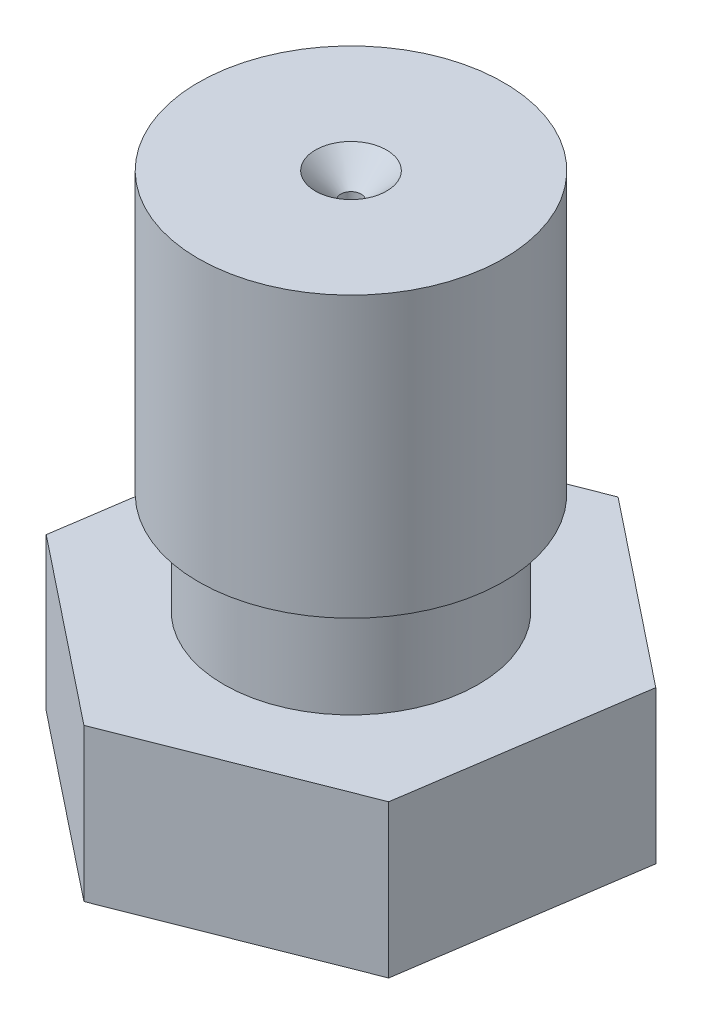
ISO-10303-21;
HEADER;
FILE_DESCRIPTION(('STEP AP214'),'2;1');
FILE_NAME('part.step','',(''),(''),'','','');
FILE_SCHEMA(('AUTOMOTIVE_DESIGN { 1 0 10303 214 1 1 1 1 }'));
ENDSEC;
DATA;
#1=APPLICATION_CONTEXT('core data for automotive mechanical design processes');
#2=APPLICATION_PROTOCOL_DEFINITION('international standard','automotive_design',2000,#1);
#3=PRODUCT_CONTEXT('',#1,'mechanical');
#4=PRODUCT('Part','Part','',(#3));
#5=PRODUCT_RELATED_PRODUCT_CATEGORY('part','',(#4));
#6=PRODUCT_DEFINITION_FORMATION('','',#4);
#7=PRODUCT_DEFINITION_CONTEXT('part definition',#1,'design');
#8=PRODUCT_DEFINITION('design','',#6,#7);
#9=PRODUCT_DEFINITION_SHAPE('','',#8);
#10=(LENGTH_UNIT() NAMED_UNIT(*) SI_UNIT(.MILLI.,.METRE.));
#11=(NAMED_UNIT(*) PLANE_ANGLE_UNIT() SI_UNIT($,.RADIAN.));
#12=(NAMED_UNIT(*) SI_UNIT($,.STERADIAN.) SOLID_ANGLE_UNIT());
#13=UNCERTAINTY_MEASURE_WITH_UNIT(LENGTH_MEASURE(1.E-05),#10,'distance_accuracy_value','');
#14=(GEOMETRIC_REPRESENTATION_CONTEXT(3) GLOBAL_UNCERTAINTY_ASSIGNED_CONTEXT((#13)) GLOBAL_UNIT_ASSIGNED_CONTEXT((#10,
#11,#12)) REPRESENTATION_CONTEXT('',''));
#15=CARTESIAN_POINT('',(0.,0.,0.));
#16=DIRECTION('',(0.,0.,1.));
#17=DIRECTION('',(1.,0.,0.));
#18=AXIS2_PLACEMENT_3D('',#15,#16,#17);
#19=CARTESIAN_POINT('',(0.,2.,0.));
#20=DIRECTION('',(0.,1.,0.));
#21=DIRECTION('',(0.,0.,1.));
#22=AXIS2_PLACEMENT_3D('',#19,#20,#21);
#23=PLANE('',#22);
#24=CARTESIAN_POINT('',(0.,2.,0.));
#25=DIRECTION('',(0.,1.,0.));
#26=DIRECTION('',(0.,0.,1.));
#27=AXIS2_PLACEMENT_3D('',#24,#25,#26);
#28=CIRCLE('',#27,2.00041507641941);
#29=CARTESIAN_POINT('',(0.,2.,2.00041507641941));
#30=VERTEX_POINT('',#29);
#31=EDGE_CURVE('E130',#30,#30,#28,.T.);
#32=ORIENTED_EDGE('',*,*,#31,.T.);
#33=EDGE_LOOP('',(#32));
#34=FACE_BOUND('',#33,.T.);
#35=DIRECTION('',(0.782739224767982,0.,0.622349826070209));
#36=VECTOR('',#35,1.);
#37=CARTESIAN_POINT('',(-2.48939930428083,2.,3.13095689907193));
#38=LINE('',#37,#36);
#39=CARTESIAN_POINT('',(-4.29705811278113,2.,1.69370154062492));
#40=VERTEX_POINT('',#39);
#41=CARTESIAN_POINT('',(-0.681740495780542,2.,4.56821225751893));
#42=VERTEX_POINT('',#41);
#43=EDGE_CURVE('E116',#40,#42,#38,.T.);
#44=ORIENTED_EDGE('',*,*,#43,.F.);
#45=DIRECTION('',(-0.147601147033637,0.,0.989046966222714));
#46=VECTOR('',#45,1.);
#47=CARTESIAN_POINT('',(-3.95618786489085,2.,-0.590404588134547));
#48=LINE('',#47,#46);
#49=CARTESIAN_POINT('',(-3.61531761700058,2.,-2.87451071689401));
#50=VERTEX_POINT('',#49);
#51=EDGE_CURVE('E114',#50,#40,#48,.T.);
#52=ORIENTED_EDGE('',*,*,#51,.F.);
#53=DIRECTION('',(-0.930340371801619,0.,0.366697140152505));
#54=VECTOR('',#53,1.);
#55=CARTESIAN_POINT('',(-1.46678856061002,2.,-3.72136148720648));
#56=LINE('',#55,#54);
#57=CARTESIAN_POINT('',(0.681740495780541,2.,-4.56821225751893));
#58=VERTEX_POINT('',#57);
#59=EDGE_CURVE('E112',#58,#50,#56,.T.);
#60=ORIENTED_EDGE('',*,*,#59,.F.);
#61=DIRECTION('',(-0.782739224767982,0.,-0.622349826070209));
#62=VECTOR('',#61,1.);
#63=CARTESIAN_POINT('',(2.48939930428083,2.,-3.13095689907193));
#64=LINE('',#63,#62);
#65=CARTESIAN_POINT('',(4.29705811278112,2.,-1.69370154062492));
#66=VERTEX_POINT('',#65);
#67=EDGE_CURVE('E110',#66,#58,#64,.T.);
#68=ORIENTED_EDGE('',*,*,#67,.F.);
#69=DIRECTION('',(0.147601147033637,0.,-0.989046966222714));
#70=VECTOR('',#69,1.);
#71=CARTESIAN_POINT('',(3.95618786489085,2.,0.590404588134546));
#72=LINE('',#71,#70);
#73=CARTESIAN_POINT('',(3.61531761700058,2.,2.87451071689401));
#74=VERTEX_POINT('',#73);
#75=EDGE_CURVE('E72',#74,#66,#72,.T.);
#76=ORIENTED_EDGE('',*,*,#75,.F.);
#77=DIRECTION('',(0.930340371801619,0.,-0.366697140152505));
#78=VECTOR('',#77,1.);
#79=CARTESIAN_POINT('',(1.46678856061002,2.,3.72136148720648));
#80=LINE('',#79,#78);
#81=EDGE_CURVE('E102',#42,#74,#80,.T.);
#82=ORIENTED_EDGE('',*,*,#81,.F.);
#83=EDGE_LOOP('',(#44,#52,#60,#68,#76,#82));
#84=FACE_BOUND('',#83,.T.);
#85=ADVANCED_FACE('F16',(#34,#84),#23,.F.);
#86=CARTESIAN_POINT('',(0.,5.,0.));
#87=DIRECTION('',(0.,-1.,0.));
#88=DIRECTION('',(0.,0.,-1.));
#89=AXIS2_PLACEMENT_3D('',#86,#87,#88);
#90=PLANE('',#89);
#91=CARTESIAN_POINT('',(0.,5.,0.));
#92=DIRECTION('',(0.,1.,0.));
#93=DIRECTION('',(0.,0.,1.));
#94=AXIS2_PLACEMENT_3D('',#91,#92,#93);
#95=CIRCLE('',#94,2.5);
#96=CARTESIAN_POINT('',(0.,5.,2.5));
#97=VERTEX_POINT('',#96);
#98=EDGE_CURVE('E127',#97,#97,#95,.T.);
#99=ORIENTED_EDGE('',*,*,#98,.F.);
#100=EDGE_LOOP('',(#99));
#101=FACE_BOUND('',#100,.T.);
#102=DIRECTION('',(0.782739224767982,0.,0.622349826070209));
#103=VECTOR('',#102,1.);
#104=CARTESIAN_POINT('',(-4.29705811278113,5.,1.69370154062492));
#105=LINE('',#104,#103);
#106=CARTESIAN_POINT('',(-4.29705811278113,5.,1.69370154062492));
#107=VERTEX_POINT('',#106);
#108=CARTESIAN_POINT('',(-0.681740495780542,5.,4.56821225751893));
#109=VERTEX_POINT('',#108);
#110=EDGE_CURVE('E92',#107,#109,#105,.T.);
#111=ORIENTED_EDGE('',*,*,#110,.T.);
#112=DIRECTION('',(0.930340371801619,0.,-0.366697140152505));
#113=VECTOR('',#112,1.);
#114=CARTESIAN_POINT('',(-0.681740495780542,5.,4.56821225751893));
#115=LINE('',#114,#113);
#116=CARTESIAN_POINT('',(3.61531761700058,5.,2.87451071689401));
#117=VERTEX_POINT('',#116);
#118=EDGE_CURVE('E90',#109,#117,#115,.T.);
#119=ORIENTED_EDGE('',*,*,#118,.T.);
#120=DIRECTION('',(0.147601147033637,0.,-0.989046966222714));
#121=VECTOR('',#120,1.);
#122=CARTESIAN_POINT('',(3.61531761700058,5.,2.87451071689401));
#123=LINE('',#122,#121);
#124=CARTESIAN_POINT('',(4.29705811278112,5.,-1.69370154062492));
#125=VERTEX_POINT('',#124);
#126=EDGE_CURVE('E39',#117,#125,#123,.T.);
#127=ORIENTED_EDGE('',*,*,#126,.T.);
#128=DIRECTION('',(-0.782739224767982,0.,-0.622349826070208));
#129=VECTOR('',#128,1.);
#130=CARTESIAN_POINT('',(4.29705811278112,5.,-1.69370154062492));
#131=LINE('',#130,#129);
#132=CARTESIAN_POINT('',(0.681740495780541,5.,-4.56821225751893));
#133=VERTEX_POINT('',#132);
#134=EDGE_CURVE('E79',#125,#133,#131,.T.);
#135=ORIENTED_EDGE('',*,*,#134,.T.);
#136=DIRECTION('',(-0.930340371801619,0.,0.366697140152505));
#137=VECTOR('',#136,1.);
#138=CARTESIAN_POINT('',(0.681740495780541,5.,-4.56821225751893));
#139=LINE('',#138,#137);
#140=CARTESIAN_POINT('',(-3.61531761700058,5.,-2.87451071689401));
#141=VERTEX_POINT('',#140);
#142=EDGE_CURVE('E85',#133,#141,#139,.T.);
#143=ORIENTED_EDGE('',*,*,#142,.T.);
#144=DIRECTION('',(-0.147601147033637,0.,0.989046966222714));
#145=VECTOR('',#144,1.);
#146=CARTESIAN_POINT('',(-3.61531761700058,5.,-2.87451071689401));
#147=LINE('',#146,#145);
#148=EDGE_CURVE('E97',#141,#107,#147,.T.);
#149=ORIENTED_EDGE('',*,*,#148,.T.);
#150=EDGE_LOOP('',(#111,#119,#127,#135,#143,#149));
#151=FACE_BOUND('',#150,.T.);
#152=ADVANCED_FACE('F89',(#101,#151),#90,.F.);
#153=CARTESIAN_POINT('',(0.,12.5,0.));
#154=DIRECTION('',(0.,1.,0.));
#155=DIRECTION('',(0.,0.,1.));
#156=AXIS2_PLACEMENT_3D('',#153,#154,#155);
#157=PLANE('',#156);
#158=CARTESIAN_POINT('',(0.,12.5,0.));
#159=DIRECTION('',(0.,1.,0.));
#160=DIRECTION('',(0.,0.,1.));
#161=AXIS2_PLACEMENT_3D('',#158,#159,#160);
#162=CIRCLE('',#161,0.7);
#163=CARTESIAN_POINT('',(0.,12.5,0.700000000000002));
#164=VERTEX_POINT('',#163);
#165=EDGE_CURVE('E11',#164,#164,#162,.F.);
#166=ORIENTED_EDGE('',*,*,#165,.T.);
#167=EDGE_LOOP('',(#166));
#168=FACE_BOUND('',#167,.T.);
#169=CARTESIAN_POINT('',(0.,12.5,0.));
#170=DIRECTION('',(0.,1.,0.));
#171=DIRECTION('',(0.,0.,1.));
#172=AXIS2_PLACEMENT_3D('',#169,#170,#171);
#173=CIRCLE('',#172,3.);
#174=CARTESIAN_POINT('',(0.,12.5,3.));
#175=VERTEX_POINT('',#174);
#176=EDGE_CURVE('E118',#175,#175,#173,.T.);
#177=ORIENTED_EDGE('',*,*,#176,.T.);
#178=EDGE_LOOP('',(#177));
#179=FACE_BOUND('',#178,.T.);
#180=ADVANCED_FACE('F168',(#168,#179),#157,.T.);
#181=CARTESIAN_POINT('',(0.,12.5,0.));
#182=DIRECTION('',(0.,1.,0.));
#183=DIRECTION('',(0.,0.,1.));
#184=AXIS2_PLACEMENT_3D('',#181,#182,#183);
#185=CYLINDRICAL_SURFACE('',#184,0.2);
#186=CARTESIAN_POINT('',(0.,12.,0.));
#187=DIRECTION('',(0.,1.,0.));
#188=DIRECTION('',(0.,0.,1.));
#189=AXIS2_PLACEMENT_3D('',#186,#187,#188);
#190=CIRCLE('',#189,0.2);
#191=CARTESIAN_POINT('',(0.,12.,0.199999999999999));
#192=VERTEX_POINT('',#191);
#193=EDGE_CURVE('E24',#192,#192,#190,.T.);
#194=ORIENTED_EDGE('',*,*,#193,.T.);
#195=EDGE_LOOP('',(#194));
#196=FACE_BOUND('',#195,.T.);
#197=CARTESIAN_POINT('',(0.,0.,0.));
#198=DIRECTION('',(0.,1.,0.));
#199=DIRECTION('',(0.,0.,1.));
#200=AXIS2_PLACEMENT_3D('',#197,#198,#199);
#201=CIRCLE('',#200,0.2);
#202=CARTESIAN_POINT('',(0.,0.,0.2));
#203=VERTEX_POINT('',#202);
#204=EDGE_CURVE('E136',#203,#203,#201,.T.);
#205=ORIENTED_EDGE('',*,*,#204,.F.);
#206=EDGE_LOOP('',(#205));
#207=FACE_BOUND('',#206,.T.);
#208=ADVANCED_FACE('F141',(#196,#207),#185,.F.);
#209=CARTESIAN_POINT('',(0.,0.,0.));
#210=DIRECTION('',(0.,1.,0.));
#211=DIRECTION('',(0.,0.,1.));
#212=AXIS2_PLACEMENT_3D('',#209,#210,#211);
#213=PLANE('',#212);
#214=CARTESIAN_POINT('',(0.,0.,0.));
#215=DIRECTION('',(0.,1.,0.));
#216=DIRECTION('',(0.,0.,1.));
#217=AXIS2_PLACEMENT_3D('',#214,#215,#216);
#218=CIRCLE('',#217,0.6);
#219=CARTESIAN_POINT('',(0.,0.,0.6));
#220=VERTEX_POINT('',#219);
#221=EDGE_CURVE('E133',#220,#220,#218,.T.);
#222=ORIENTED_EDGE('',*,*,#221,.F.);
#223=EDGE_LOOP('',(#222));
#224=FACE_BOUND('',#223,.T.);
#225=ORIENTED_EDGE('',*,*,#204,.T.);
#226=EDGE_LOOP('',(#225));
#227=FACE_BOUND('',#226,.T.);
#228=ADVANCED_FACE('F178',(#224,#227),#213,.F.);
#229=CARTESIAN_POINT('',(0.,0.,0.));
#230=DIRECTION('',(0.,1.,0.));
#231=DIRECTION('',(0.,0.,1.));
#232=AXIS2_PLACEMENT_3D('',#229,#230,#231);
#233=CONICAL_SURFACE('',#232,0.6,0.610865238198013);
#234=CARTESIAN_POINT('',(0.,2.,2.00041507641941));
#235=CARTESIAN_POINT('',(0.,1.97916666666667,1.98582741937338));
#236=CARTESIAN_POINT('',(0.,1.95833333333333,1.97123976232734));
#237=CARTESIAN_POINT('',(0.,1.91666666666667,1.94206444823527));
#238=CARTESIAN_POINT('',(0.,1.89583333333333,1.92747679118923));
#239=CARTESIAN_POINT('',(0.,1.85416666666667,1.89830147709716));
#240=CARTESIAN_POINT('',(0.,1.83333333333333,1.88371382005113));
#241=CARTESIAN_POINT('',(0.,1.79166666666667,1.85453850595906));
#242=CARTESIAN_POINT('',(0.,1.77083333333333,1.83995084891302));
#243=CARTESIAN_POINT('',(0.,1.72916666666667,1.81077553482095));
#244=CARTESIAN_POINT('',(0.,1.70833333333333,1.79618787777491));
#245=CARTESIAN_POINT('',(0.,1.66666666666667,1.76701256368284));
#246=CARTESIAN_POINT('',(0.,1.64583333333333,1.75242490663681));
#247=CARTESIAN_POINT('',(0.,1.60416666666667,1.72324959254474));
#248=CARTESIAN_POINT('',(0.,1.58333333333333,1.7086619354987));
#249=CARTESIAN_POINT('',(0.,1.54166666666667,1.67948662140663));
#250=CARTESIAN_POINT('',(0.,1.52083333333333,1.66489896436059));
#251=CARTESIAN_POINT('',(0.,1.47916666666667,1.63572365026852));
#252=CARTESIAN_POINT('',(0.,1.45833333333333,1.62113599322249));
#253=CARTESIAN_POINT('',(0.,1.41666666666667,1.59196067913042));
#254=CARTESIAN_POINT('',(0.,1.39583333333333,1.57737302208438));
#255=CARTESIAN_POINT('',(0.,1.35416666666667,1.54819770799231));
#256=CARTESIAN_POINT('',(0.,1.33333333333333,1.53361005094627));
#257=CARTESIAN_POINT('',(0.,1.29166666666667,1.5044347368542));
#258=CARTESIAN_POINT('',(0.,1.27083333333333,1.48984707980817));
#259=CARTESIAN_POINT('',(0.,1.22916666666667,1.4606717657161));
#260=CARTESIAN_POINT('',(0.,1.20833333333333,1.44608410867006));
#261=CARTESIAN_POINT('',(0.,1.16666666666667,1.41690879457799));
#262=CARTESIAN_POINT('',(0.,1.14583333333333,1.40232113753195));
#263=CARTESIAN_POINT('',(0.,1.10416666666667,1.37314582343988));
#264=CARTESIAN_POINT('',(0.,1.08333333333333,1.35855816639385));
#265=CARTESIAN_POINT('',(0.,1.04166666666667,1.32938285230178));
#266=CARTESIAN_POINT('',(0.,1.02083333333333,1.31479519525574));
#267=CARTESIAN_POINT('',(0.,0.979166666666667,1.28561988116367));
#268=CARTESIAN_POINT('',(0.,0.958333333333333,1.27103222411763));
#269=CARTESIAN_POINT('',(0.,0.916666666666667,1.24185691002556));
#270=CARTESIAN_POINT('',(0.,0.895833333333333,1.22726925297953));
#271=CARTESIAN_POINT('',(0.,0.854166666666667,1.19809393888746));
#272=CARTESIAN_POINT('',(0.,0.833333333333333,1.18350628184142));
#273=CARTESIAN_POINT('',(0.,0.791666666666667,1.15433096774935));
#274=CARTESIAN_POINT('',(0.,0.770833333333333,1.13974331070332));
#275=CARTESIAN_POINT('',(0.,0.729166666666667,1.11056799661124));
#276=CARTESIAN_POINT('',(0.,0.708333333333333,1.09598033956521));
#277=CARTESIAN_POINT('',(0.,0.666666666666667,1.06680502547314));
#278=CARTESIAN_POINT('',(0.,0.645833333333333,1.0522173684271));
#279=CARTESIAN_POINT('',(0.,0.604166666666667,1.02304205433503));
#280=CARTESIAN_POINT('',(0.,0.583333333333333,1.008454397289));
#281=CARTESIAN_POINT('',(0.,0.541666666666667,0.979279083196924));
#282=CARTESIAN_POINT('',(0.,0.520833333333333,0.964691426150889));
#283=CARTESIAN_POINT('',(0.,0.479166666666667,0.935516112058817));
#284=CARTESIAN_POINT('',(0.,0.458333333333333,0.920928455012782));
#285=CARTESIAN_POINT('',(0.,0.416666666666667,0.891753140920711));
#286=CARTESIAN_POINT('',(0.,0.395833333333333,0.877165483874675));
#287=CARTESIAN_POINT('',(0.,0.354166666666667,0.847990169782604));
#288=CARTESIAN_POINT('',(0.,0.333333333333333,0.833402512736569));
#289=CARTESIAN_POINT('',(0.,0.291666666666667,0.804227198644498));
#290=CARTESIAN_POINT('',(0.,0.270833333333333,0.789639541598462));
#291=CARTESIAN_POINT('',(0.,0.229166666666667,0.760464227506391));
#292=CARTESIAN_POINT('',(0.,0.208333333333333,0.745876570460355));
#293=CARTESIAN_POINT('',(0.,0.166666666666667,0.716701256368284));
#294=CARTESIAN_POINT('',(0.,0.145833333333333,0.702113599322249));
#295=CARTESIAN_POINT('',(0.,0.104166666666667,0.672938285230178));
#296=CARTESIAN_POINT('',(0.,0.0833333333333334,0.658350628184142));
#297=CARTESIAN_POINT('',(0.,0.0416666666666667,0.629175314092071));
#298=CARTESIAN_POINT('',(0.,0.0208333333333333,0.614587657046035));
#299=CARTESIAN_POINT('',(0.,0.,0.6));
#300=B_SPLINE_CURVE_WITH_KNOTS('',3,(#234,#235,#236,#237,#238,#239,#240,#241,#242,#243,#244,
#245,#246,#247,#248,#249,#250,#251,#252,#253,#254,#255,#256,#257,#258,#259,#260,#261,#262,#263,
#264,#265,#266,#267,#268,#269,#270,#271,#272,#273,#274,#275,#276,#277,#278,#279,#280,#281,#282,
#283,#284,#285,#286,#287,#288,#289,#290,#291,#292,#293,#294,#295,#296,#297,#298,#299),
.UNSPECIFIED.,.F.,.F.,(4,2,2,2,2,2,2,2,2,2,2,2,2,2,2,2,2,2,2,2,2,2,2,2,2,2,2,2,2,2,2,2,4),(0.,
0.076298411797591,0.152596823595182,0.228895235392773,0.305193647190364,0.381492058987955,
0.457790470785545,0.534088882583136,0.610387294380727,0.686685706178318,0.762984117975909,
0.8392825297735,0.915580941571091,0.991879353368681,1.06817776516627,1.14447617696386,
1.22077458876145,1.29707300055905,1.37337141235664,1.44966982415423,1.52596823595182,
1.60226664774941,1.678565059547,1.75486347134459,1.83116188314218,1.90746029493977,
1.98375870673736,2.06005711853495,2.13635553033254,2.21265394213014,2.28895235392773,
2.36525076572532,2.44154917752291),.UNSPECIFIED.);
#301=EDGE_CURVE('BSEAM174',#30,#220,#300,.T.);
#302=ORIENTED_EDGE('',*,*,#31,.F.);
#303=ORIENTED_EDGE('',*,*,#221,.T.);
#304=ORIENTED_EDGE('',*,*,#301,.T.);
#305=ORIENTED_EDGE('',*,*,#301,.F.);
#306=EDGE_LOOP('',(#302,#304,#303,#305));
#307=FACE_BOUND('',#306,.T.);
#308=ADVANCED_FACE('F174',(#307),#233,.T.);
#309=CARTESIAN_POINT('',(0.,12.5,0.));
#310=DIRECTION('',(0.,1.,0.));
#311=DIRECTION('',(0.,0.,1.));
#312=AXIS2_PLACEMENT_3D('',#309,#310,#311);
#313=CYLINDRICAL_SURFACE('',#312,2.5);
#314=CARTESIAN_POINT('',(0.,7.,0.));
#315=DIRECTION('',(0.,1.,0.));
#316=DIRECTION('',(0.,0.,1.));
#317=AXIS2_PLACEMENT_3D('',#314,#315,#316);
#318=CIRCLE('',#317,2.5);
#319=CARTESIAN_POINT('',(0.,7.,2.5));
#320=VERTEX_POINT('',#319);
#321=EDGE_CURVE('E124',#320,#320,#318,.T.);
#322=ORIENTED_EDGE('',*,*,#321,.F.);
#323=EDGE_LOOP('',(#322));
#324=FACE_BOUND('',#323,.T.);
#325=ORIENTED_EDGE('',*,*,#98,.T.);
#326=EDGE_LOOP('',(#325));
#327=FACE_BOUND('',#326,.T.);
#328=ADVANCED_FACE('F177',(#324,#327),#313,.T.);
#329=CARTESIAN_POINT('',(0.,7.,0.));
#330=DIRECTION('',(0.,1.,0.));
#331=DIRECTION('',(0.,0.,1.));
#332=AXIS2_PLACEMENT_3D('',#329,#330,#331);
#333=PLANE('',#332);
#334=CARTESIAN_POINT('',(0.,7.,0.));
#335=DIRECTION('',(0.,1.,0.));
#336=DIRECTION('',(0.,0.,1.));
#337=AXIS2_PLACEMENT_3D('',#334,#335,#336);
#338=CIRCLE('',#337,3.);
#339=CARTESIAN_POINT('',(0.,7.,3.));
#340=VERTEX_POINT('',#339);
#341=EDGE_CURVE('E121',#340,#340,#338,.T.);
#342=ORIENTED_EDGE('',*,*,#341,.F.);
#343=EDGE_LOOP('',(#342));
#344=FACE_BOUND('',#343,.T.);
#345=ORIENTED_EDGE('',*,*,#321,.T.);
#346=EDGE_LOOP('',(#345));
#347=FACE_BOUND('',#346,.T.);
#348=ADVANCED_FACE('F157',(#344,#347),#333,.F.);
#349=CARTESIAN_POINT('',(0.,12.5,0.));
#350=DIRECTION('',(0.,1.,0.));
#351=DIRECTION('',(0.,0.,1.));
#352=AXIS2_PLACEMENT_3D('',#349,#350,#351);
#353=CYLINDRICAL_SURFACE('',#352,3.);
#354=ORIENTED_EDGE('',*,*,#176,.F.);
#355=EDGE_LOOP('',(#354));
#356=FACE_BOUND('',#355,.T.);
#357=ORIENTED_EDGE('',*,*,#341,.T.);
#358=EDGE_LOOP('',(#357));
#359=FACE_BOUND('',#358,.T.);
#360=ADVANCED_FACE('F146',(#356,#359),#353,.T.);
#361=CARTESIAN_POINT('',(0.,12.,0.));
#362=DIRECTION('',(0.,1.,0.));
#363=DIRECTION('',(0.,0.,1.));
#364=AXIS2_PLACEMENT_3D('',#361,#362,#363);
#365=CONICAL_SURFACE('',#364,0.2,0.78539816339745);
#366=CARTESIAN_POINT('',(0.,12.5,0.700000000000002));
#367=CARTESIAN_POINT('',(0.,12.4947916666667,0.694791666666669));
#368=CARTESIAN_POINT('',(0.,12.4895833333333,0.689583333333336));
#369=CARTESIAN_POINT('',(0.,12.4791666666667,0.679166666666668));
#370=CARTESIAN_POINT('',(0.,12.4739583333333,0.673958333333334));
#371=CARTESIAN_POINT('',(0.,12.4635416666667,0.663541666666668));
#372=CARTESIAN_POINT('',(0.,12.4583333333333,0.658333333333335));
#373=CARTESIAN_POINT('',(0.,12.4479166666667,0.647916666666668));
#374=CARTESIAN_POINT('',(0.,12.4427083333333,0.642708333333334));
#375=CARTESIAN_POINT('',(0.,12.4322916666667,0.632291666666668));
#376=CARTESIAN_POINT('',(0.,12.4270833333333,0.627083333333335));
#377=CARTESIAN_POINT('',(0.,12.4166666666667,0.616666666666668));
#378=CARTESIAN_POINT('',(0.,12.4114583333333,0.611458333333334));
#379=CARTESIAN_POINT('',(0.,12.4010416666667,0.601041666666668));
#380=CARTESIAN_POINT('',(0.,12.3958333333333,0.595833333333335));
#381=CARTESIAN_POINT('',(0.,12.3854166666667,0.585416666666668));
#382=CARTESIAN_POINT('',(0.,12.3802083333333,0.580208333333334));
#383=CARTESIAN_POINT('',(0.,12.3697916666667,0.569791666666667));
#384=CARTESIAN_POINT('',(0.,12.3645833333333,0.564583333333335));
#385=CARTESIAN_POINT('',(0.,12.3541666666667,0.554166666666668));
#386=CARTESIAN_POINT('',(0.,12.3489583333333,0.548958333333334));
#387=CARTESIAN_POINT('',(0.,12.3385416666667,0.538541666666667));
#388=CARTESIAN_POINT('',(0.,12.3333333333333,0.533333333333334));
#389=CARTESIAN_POINT('',(0.,12.3229166666667,0.522916666666668));
#390=CARTESIAN_POINT('',(0.,12.3177083333333,0.517708333333334));
#391=CARTESIAN_POINT('',(0.,12.3072916666667,0.507291666666667));
#392=CARTESIAN_POINT('',(0.,12.3020833333333,0.502083333333334));
#393=CARTESIAN_POINT('',(0.,12.2916666666667,0.491666666666668));
#394=CARTESIAN_POINT('',(0.,12.2864583333333,0.486458333333334));
#395=CARTESIAN_POINT('',(0.,12.2760416666667,0.476041666666667));
#396=CARTESIAN_POINT('',(0.,12.2708333333333,0.470833333333334));
#397=CARTESIAN_POINT('',(0.,12.2604166666667,0.460416666666667));
#398=CARTESIAN_POINT('',(0.,12.2552083333333,0.455208333333333));
#399=CARTESIAN_POINT('',(0.,12.2447916666667,0.444791666666667));
#400=CARTESIAN_POINT('',(0.,12.2395833333333,0.439583333333334));
#401=CARTESIAN_POINT('',(0.,12.2291666666667,0.429166666666667));
#402=CARTESIAN_POINT('',(0.,12.2239583333333,0.423958333333333));
#403=CARTESIAN_POINT('',(0.,12.2135416666667,0.413541666666667));
#404=CARTESIAN_POINT('',(0.,12.2083333333333,0.408333333333334));
#405=CARTESIAN_POINT('',(0.,12.1979166666667,0.397916666666667));
#406=CARTESIAN_POINT('',(0.,12.1927083333333,0.392708333333333));
#407=CARTESIAN_POINT('',(0.,12.1822916666667,0.382291666666666));
#408=CARTESIAN_POINT('',(0.,12.1770833333333,0.377083333333334));
#409=CARTESIAN_POINT('',(0.,12.1666666666667,0.366666666666667));
#410=CARTESIAN_POINT('',(0.,12.1614583333333,0.361458333333333));
#411=CARTESIAN_POINT('',(0.,12.1510416666667,0.351041666666666));
#412=CARTESIAN_POINT('',(0.,12.1458333333333,0.345833333333333));
#413=CARTESIAN_POINT('',(0.,12.1354166666667,0.335416666666667));
#414=CARTESIAN_POINT('',(0.,12.1302083333333,0.330208333333333));
#415=CARTESIAN_POINT('',(0.,12.1197916666667,0.319791666666666));
#416=CARTESIAN_POINT('',(0.,12.1145833333333,0.314583333333333));
#417=CARTESIAN_POINT('',(0.,12.1041666666667,0.304166666666667));
#418=CARTESIAN_POINT('',(0.,12.0989583333333,0.298958333333333));
#419=CARTESIAN_POINT('',(0.,12.0885416666667,0.288541666666666));
#420=CARTESIAN_POINT('',(0.,12.0833333333333,0.283333333333333));
#421=CARTESIAN_POINT('',(0.,12.0729166666667,0.272916666666666));
#422=CARTESIAN_POINT('',(0.,12.0677083333333,0.267708333333333));
#423=CARTESIAN_POINT('',(0.,12.0572916666667,0.257291666666666));
#424=CARTESIAN_POINT('',(0.,12.0520833333333,0.252083333333333));
#425=CARTESIAN_POINT('',(0.,12.0416666666667,0.241666666666666));
#426=CARTESIAN_POINT('',(0.,12.0364583333333,0.236458333333332));
#427=CARTESIAN_POINT('',(0.,12.0260416666667,0.226041666666666));
#428=CARTESIAN_POINT('',(0.,12.0208333333333,0.220833333333333));
#429=CARTESIAN_POINT('',(0.,12.0104166666667,0.210416666666666));
#430=CARTESIAN_POINT('',(0.,12.0052083333333,0.205208333333333));
#431=CARTESIAN_POINT('',(0.,12.,0.199999999999999));
#432=B_SPLINE_CURVE_WITH_KNOTS('',3,(#366,#367,#368,#369,#370,#371,#372,#373,#374,#375,#376,
#377,#378,#379,#380,#381,#382,#383,#384,#385,#386,#387,#388,#389,#390,#391,#392,#393,#394,#395,
#396,#397,#398,#399,#400,#401,#402,#403,#404,#405,#406,#407,#408,#409,#410,#411,#412,#413,#414,
#415,#416,#417,#418,#419,#420,#421,#422,#423,#424,#425,#426,#427,#428,#429,#430,#431),
.UNSPECIFIED.,.F.,.F.,(4,2,2,2,2,2,2,2,2,2,2,2,2,2,2,2,2,2,2,2,2,2,2,2,2,2,2,2,2,2,2,2,4),(0.,
0.0220970869120809,0.0441941738241593,0.0662912607362402,0.0883883476483187,0.1104854345604,
0.132582521472478,0.154679608384559,0.176776695296637,0.198873782208718,0.220970869120797,
0.243067956032878,0.265165042944956,0.287262129857037,0.309359216769115,0.331456303681196,
0.353553390593275,0.375650477505356,0.397747564417434,0.419844651329515,0.441941738241593,
0.464038825153674,0.486135912065753,0.508232998977834,0.530330085889912,0.552427172801993,
0.574524259714072,0.596621346626153,0.618718433538231,0.640815520450312,0.66291260736239,
0.685009694274471,0.70710678118655),.UNSPECIFIED.);
#433=EDGE_CURVE('BSEAM18',#164,#192,#432,.T.);
#434=ORIENTED_EDGE('',*,*,#165,.F.);
#435=ORIENTED_EDGE('',*,*,#193,.F.);
#436=ORIENTED_EDGE('',*,*,#433,.T.);
#437=ORIENTED_EDGE('',*,*,#433,.F.);
#438=EDGE_LOOP('',(#434,#436,#435,#437));
#439=FACE_BOUND('',#438,.T.);
#440=ADVANCED_FACE('F18',(#439),#365,.F.);
#441=CARTESIAN_POINT('',(-4.29705811278113,-5.,1.69370154062492));
#442=DIRECTION('',(-0.622349826070209,0.,0.782739224767982));
#443=DIRECTION('',(0.782739224767982,0.,0.622349826070209));
#444=AXIS2_PLACEMENT_3D('',#441,#442,#443);
#445=PLANE('',#444);
#446=ORIENTED_EDGE('',*,*,#43,.T.);
#447=DIRECTION('',(0.,1.,0.));
#448=VECTOR('',#447,1.);
#449=CARTESIAN_POINT('',(-0.681740495780542,-5.,4.56821225751893));
#450=LINE('',#449,#448);
#451=EDGE_CURVE('E31',#42,#109,#450,.T.);
#452=ORIENTED_EDGE('',*,*,#451,.T.);
#453=ORIENTED_EDGE('',*,*,#110,.F.);
#454=DIRECTION('',(0.,1.,0.));
#455=VECTOR('',#454,1.);
#456=CARTESIAN_POINT('',(-4.29705811278113,-5.,1.69370154062492));
#457=LINE('',#456,#455);
#458=EDGE_CURVE('E100',#40,#107,#457,.T.);
#459=ORIENTED_EDGE('',*,*,#458,.F.);
#460=EDGE_LOOP('',(#446,#452,#453,#459));
#461=FACE_BOUND('',#460,.T.);
#462=ADVANCED_FACE('F145',(#461),#445,.T.);
#463=CARTESIAN_POINT('',(-3.61531761700058,-5.,-2.87451071689401));
#464=DIRECTION('',(-0.989046966222714,0.,-0.147601147033637));
#465=DIRECTION('',(-0.147601147033637,0.,0.989046966222714));
#466=AXIS2_PLACEMENT_3D('',#463,#464,#465);
#467=PLANE('',#466);
#468=ORIENTED_EDGE('',*,*,#51,.T.);
#469=ORIENTED_EDGE('',*,*,#458,.T.);
#470=ORIENTED_EDGE('',*,*,#148,.F.);
#471=DIRECTION('',(0.,1.,0.));
#472=VECTOR('',#471,1.);
#473=CARTESIAN_POINT('',(-3.61531761700058,-5.,-2.87451071689401));
#474=LINE('',#473,#472);
#475=EDGE_CURVE('E103',#50,#141,#474,.T.);
#476=ORIENTED_EDGE('',*,*,#475,.F.);
#477=EDGE_LOOP('',(#468,#469,#470,#476));
#478=FACE_BOUND('',#477,.T.);
#479=ADVANCED_FACE('F154',(#478),#467,.T.);
#480=CARTESIAN_POINT('',(0.681740495780541,-5.,-4.56821225751893));
#481=DIRECTION('',(-0.366697140152505,0.,-0.930340371801619));
#482=DIRECTION('',(-0.930340371801619,0.,0.366697140152505));
#483=AXIS2_PLACEMENT_3D('',#480,#481,#482);
#484=PLANE('',#483);
#485=ORIENTED_EDGE('',*,*,#59,.T.);
#486=ORIENTED_EDGE('',*,*,#475,.T.);
#487=ORIENTED_EDGE('',*,*,#142,.F.);
#488=DIRECTION('',(0.,1.,0.));
#489=VECTOR('',#488,1.);
#490=CARTESIAN_POINT('',(0.681740495780541,-5.,-4.56821225751893));
#491=LINE('',#490,#489);
#492=EDGE_CURVE('E75',#58,#133,#491,.T.);
#493=ORIENTED_EDGE('',*,*,#492,.F.);
#494=EDGE_LOOP('',(#485,#486,#487,#493));
#495=FACE_BOUND('',#494,.T.);
#496=ADVANCED_FACE('F213',(#495),#484,.T.);
#497=CARTESIAN_POINT('',(4.29705811278112,-5.,-1.69370154062492));
#498=DIRECTION('',(0.622349826070208,0.,-0.782739224767982));
#499=DIRECTION('',(-0.782739224767982,0.,-0.622349826070209));
#500=AXIS2_PLACEMENT_3D('',#497,#498,#499);
#501=PLANE('',#500);
#502=ORIENTED_EDGE('',*,*,#67,.T.);
#503=ORIENTED_EDGE('',*,*,#492,.T.);
#504=ORIENTED_EDGE('',*,*,#134,.F.);
#505=DIRECTION('',(0.,1.,0.));
#506=VECTOR('',#505,1.);
#507=CARTESIAN_POINT('',(4.29705811278112,-5.,-1.69370154062492));
#508=LINE('',#507,#506);
#509=EDGE_CURVE('E68',#66,#125,#508,.T.);
#510=ORIENTED_EDGE('',*,*,#509,.F.);
#511=EDGE_LOOP('',(#502,#503,#504,#510));
#512=FACE_BOUND('',#511,.T.);
#513=ADVANCED_FACE('F80',(#512),#501,.T.);
#514=CARTESIAN_POINT('',(3.61531761700058,-5.,2.87451071689401));
#515=DIRECTION('',(0.989046966222714,0.,0.147601147033637));
#516=DIRECTION('',(0.147601147033637,0.,-0.989046966222714));
#517=AXIS2_PLACEMENT_3D('',#514,#515,#516);
#518=PLANE('',#517);
#519=ORIENTED_EDGE('',*,*,#75,.T.);
#520=ORIENTED_EDGE('',*,*,#509,.T.);
#521=ORIENTED_EDGE('',*,*,#126,.F.);
#522=DIRECTION('',(0.,1.,0.));
#523=VECTOR('',#522,1.);
#524=CARTESIAN_POINT('',(3.61531761700058,-5.,2.87451071689401));
#525=LINE('',#524,#523);
#526=EDGE_CURVE('E76',#74,#117,#525,.T.);
#527=ORIENTED_EDGE('',*,*,#526,.F.);
#528=EDGE_LOOP('',(#519,#520,#521,#527));
#529=FACE_BOUND('',#528,.T.);
#530=ADVANCED_FACE('F70',(#529),#518,.T.);
#531=CARTESIAN_POINT('',(-0.681740495780542,-5.,4.56821225751893));
#532=DIRECTION('',(0.366697140152505,0.,0.930340371801619));
#533=DIRECTION('',(0.930340371801619,0.,-0.366697140152505));
#534=AXIS2_PLACEMENT_3D('',#531,#532,#533);
#535=PLANE('',#534);
#536=ORIENTED_EDGE('',*,*,#81,.T.);
#537=ORIENTED_EDGE('',*,*,#526,.T.);
#538=ORIENTED_EDGE('',*,*,#118,.F.);
#539=ORIENTED_EDGE('',*,*,#451,.F.);
#540=EDGE_LOOP('',(#536,#537,#538,#539));
#541=FACE_BOUND('',#540,.T.);
#542=ADVANCED_FACE('F206',(#541),#535,.T.);
#543=CLOSED_SHELL('',(#85,#152,#180,#208,#228,#308,#328,#348,#360,#440,#462,#479,#496,#513,#530,#542));
#544=MANIFOLD_SOLID_BREP('B1',#543);
#545=ADVANCED_BREP_SHAPE_REPRESENTATION('',(#18,#544),#14);
#546=SHAPE_DEFINITION_REPRESENTATION(#9,#545);
ENDSEC;
END-ISO-10303-21;
